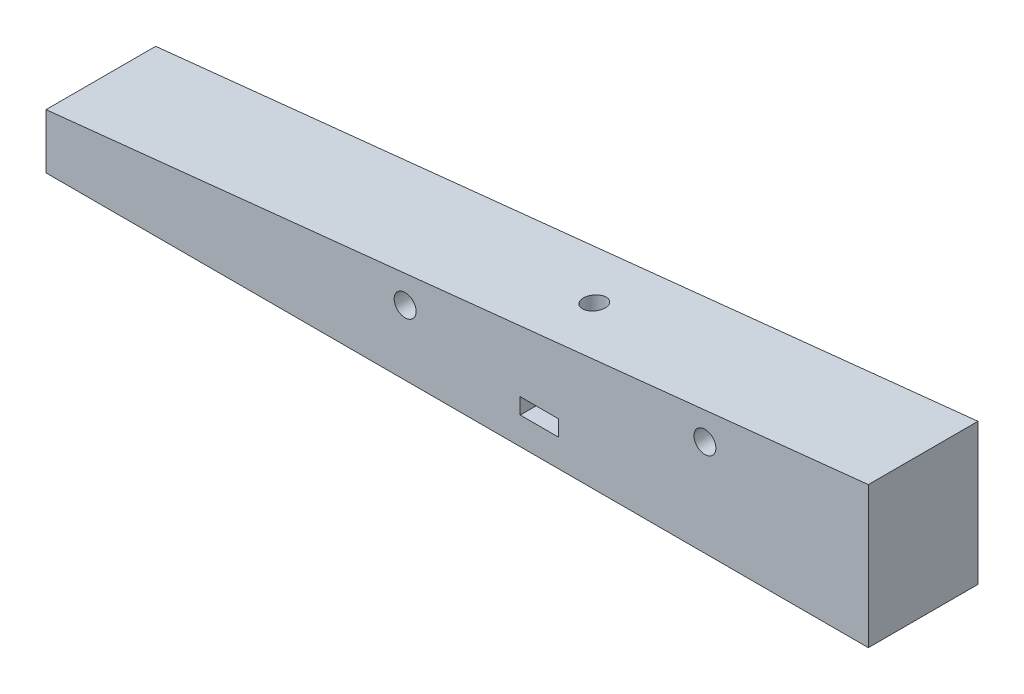
ISO-10303-21;
HEADER;
FILE_DESCRIPTION(('STEP AP214'),'2;1');
FILE_NAME('part.step','',(''),(''),'','','');
FILE_SCHEMA(('AUTOMOTIVE_DESIGN { 1 0 10303 214 1 1 1 1 }'));
ENDSEC;
DATA;
#1=APPLICATION_CONTEXT('core data for automotive mechanical design processes');
#2=APPLICATION_PROTOCOL_DEFINITION('international standard','automotive_design',2000,#1);
#3=PRODUCT_CONTEXT('',#1,'mechanical');
#4=PRODUCT('Part','Part','',(#3));
#5=PRODUCT_RELATED_PRODUCT_CATEGORY('part','',(#4));
#6=PRODUCT_DEFINITION_FORMATION('','',#4);
#7=PRODUCT_DEFINITION_CONTEXT('part definition',#1,'design');
#8=PRODUCT_DEFINITION('design','',#6,#7);
#9=PRODUCT_DEFINITION_SHAPE('','',#8);
#10=(LENGTH_UNIT() NAMED_UNIT(*) SI_UNIT(.MILLI.,.METRE.));
#11=(NAMED_UNIT(*) PLANE_ANGLE_UNIT() SI_UNIT($,.RADIAN.));
#12=(NAMED_UNIT(*) SI_UNIT($,.STERADIAN.) SOLID_ANGLE_UNIT());
#13=UNCERTAINTY_MEASURE_WITH_UNIT(LENGTH_MEASURE(1.E-05),#10,'distance_accuracy_value','');
#14=(GEOMETRIC_REPRESENTATION_CONTEXT(3) GLOBAL_UNCERTAINTY_ASSIGNED_CONTEXT((#13)) GLOBAL_UNIT_ASSIGNED_CONTEXT((#10,
#11,#12)) REPRESENTATION_CONTEXT('',''));
#15=CARTESIAN_POINT('',(0.,0.,0.));
#16=DIRECTION('',(0.,0.,1.));
#17=DIRECTION('',(1.,0.,0.));
#18=AXIS2_PLACEMENT_3D('',#15,#16,#17);
#19=CARTESIAN_POINT('',(-75.,10.,10.));
#20=DIRECTION('',(0.,0.,-1.));
#21=DIRECTION('',(-1.,0.,0.));
#22=AXIS2_PLACEMENT_3D('',#19,#20,#21);
#23=PLANE('',#22);
#24=CARTESIAN_POINT('',(-9.49268702190368,11.8575546370541,10.));
#25=DIRECTION('',(0.,0.,-1.));
#26=DIRECTION('',(-1.,0.,0.));
#27=AXIS2_PLACEMENT_3D('',#24,#25,#26);
#28=CIRCLE('',#27,2.);
#29=CARTESIAN_POINT('',(-11.4926870219037,11.8575546370541,10.));
#30=VERTEX_POINT('',#29);
#31=EDGE_CURVE('E216',#30,#30,#28,.T.);
#32=ORIENTED_EDGE('',*,*,#31,.T.);
#33=EDGE_LOOP('',(#32));
#34=FACE_BOUND('',#33,.T.);
#35=CARTESIAN_POINT('',(45.1864589676207,17.604564461263,10.));
#36=DIRECTION('',(0.,0.,-1.));
#37=DIRECTION('',(-1.,0.,0.));
#38=AXIS2_PLACEMENT_3D('',#35,#36,#37);
#39=CIRCLE('',#38,2.);
#40=CARTESIAN_POINT('',(43.1864589676207,17.604564461263,10.));
#41=VERTEX_POINT('',#40);
#42=EDGE_CURVE('E267',#41,#41,#39,.T.);
#43=ORIENTED_EDGE('',*,*,#42,.T.);
#44=EDGE_LOOP('',(#43));
#45=FACE_BOUND('',#44,.T.);
#46=DIRECTION('',(1.,0.,0.));
#47=VECTOR('',#46,1.);
#48=CARTESIAN_POINT('',(-75.,0.,10.));
#49=LINE('',#48,#47);
#50=CARTESIAN_POINT('',(-75.,0.,10.));
#51=VERTEX_POINT('',#50);
#52=CARTESIAN_POINT('',(75.,0.,10.));
#53=VERTEX_POINT('',#52);
#54=EDGE_CURVE('E88',#51,#53,#49,.T.);
#55=ORIENTED_EDGE('',*,*,#54,.T.);
#56=DIRECTION('',(0.,-1.,0.));
#57=VECTOR('',#56,1.);
#58=CARTESIAN_POINT('',(75.,10.,10.));
#59=LINE('',#58,#57);
#60=CARTESIAN_POINT('',(75.,25.7656352898504,10.));
#61=VERTEX_POINT('',#60);
#62=EDGE_CURVE('E91',#61,#53,#59,.T.);
#63=ORIENTED_EDGE('',*,*,#62,.F.);
#64=DIRECTION('',(-0.994521895368274,-0.104528463267647,0.));
#65=VECTOR('',#64,1.);
#66=CARTESIAN_POINT('',(75.,25.7656352898504,10.));
#67=LINE('',#66,#65);
#68=CARTESIAN_POINT('',(-75.,10.,10.));
#69=VERTEX_POINT('',#68);
#70=EDGE_CURVE('E116',#61,#69,#67,.T.);
#71=ORIENTED_EDGE('',*,*,#70,.T.);
#72=DIRECTION('',(0.,-1.,0.));
#73=VECTOR('',#72,1.);
#74=CARTESIAN_POINT('',(-75.,10.,10.));
#75=LINE('',#74,#73);
#76=EDGE_CURVE('E69',#69,#51,#75,.T.);
#77=ORIENTED_EDGE('',*,*,#76,.T.);
#78=EDGE_LOOP('',(#55,#63,#71,#77));
#79=FACE_BOUND('',#78,.T.);
#80=DIRECTION('',(1.,0.,0.));
#81=VECTOR('',#80,1.);
#82=CARTESIAN_POINT('',(11.5,7.9,10.));
#83=LINE('',#82,#81);
#84=CARTESIAN_POINT('',(11.5,7.9,10.));
#85=VERTEX_POINT('',#84);
#86=CARTESIAN_POINT('',(18.5,7.9,10.));
#87=VERTEX_POINT('',#86);
#88=EDGE_CURVE('E60',#85,#87,#83,.T.);
#89=ORIENTED_EDGE('',*,*,#88,.T.);
#90=DIRECTION('',(0.,-1.,0.));
#91=VECTOR('',#90,1.);
#92=CARTESIAN_POINT('',(18.5,7.9,10.));
#93=LINE('',#92,#91);
#94=CARTESIAN_POINT('',(18.5,5.,10.));
#95=VERTEX_POINT('',#94);
#96=EDGE_CURVE('E207',#87,#95,#93,.T.);
#97=ORIENTED_EDGE('',*,*,#96,.T.);
#98=DIRECTION('',(1.,0.,0.));
#99=VECTOR('',#98,1.);
#100=CARTESIAN_POINT('',(11.5,5.,10.));
#101=LINE('',#100,#99);
#102=CARTESIAN_POINT('',(11.5,5.,10.));
#103=VERTEX_POINT('',#102);
#104=EDGE_CURVE('E211',#103,#95,#101,.T.);
#105=ORIENTED_EDGE('',*,*,#104,.F.);
#106=DIRECTION('',(0.,-1.,0.));
#107=VECTOR('',#106,1.);
#108=CARTESIAN_POINT('',(11.5,7.9,10.));
#109=LINE('',#108,#107);
#110=EDGE_CURVE('E203',#85,#103,#109,.T.);
#111=ORIENTED_EDGE('',*,*,#110,.F.);
#112=EDGE_LOOP('',(#89,#97,#105,#111));
#113=FACE_BOUND('',#112,.T.);
#114=ADVANCED_FACE('F42',(#34,#45,#79,#113),#23,.F.);
#115=CARTESIAN_POINT('',(15.,25.7656352898504,0.));
#116=DIRECTION('',(0.,-1.,0.));
#117=DIRECTION('',(0.,0.,-1.));
#118=AXIS2_PLACEMENT_3D('',#115,#116,#117);
#119=CYLINDRICAL_SURFACE('',#118,2.);
#120=CARTESIAN_POINT('',(15.,19.4593811739103,0.));
#121=DIRECTION('',(0.104528463267647,-0.994521895368274,0.));
#122=DIRECTION('',(-0.994521895368274,-0.104528463267647,0.));
#123=AXIS2_PLACEMENT_3D('',#120,#121,#122);
#124=ELLIPSE('',#123,2.01101655912703,2.);
#125=CARTESIAN_POINT('',(13.,19.2491727033789,0.));
#126=VERTEX_POINT('',#125);
#127=EDGE_CURVE('E127',#126,#126,#124,.T.);
#128=ORIENTED_EDGE('',*,*,#127,.F.);
#129=EDGE_LOOP('',(#128));
#130=FACE_BOUND('',#129,.T.);
#131=CARTESIAN_POINT('',(15.,7.9,0.));
#132=DIRECTION('',(0.,-1.,0.));
#133=DIRECTION('',(1.,0.,0.));
#134=AXIS2_PLACEMENT_3D('',#131,#132,#133);
#135=CIRCLE('',#134,2.);
#136=CARTESIAN_POINT('',(17.,7.9,0.));
#137=VERTEX_POINT('',#136);
#138=EDGE_CURVE('E46',#137,#137,#135,.F.);
#139=ORIENTED_EDGE('',*,*,#138,.F.);
#140=EDGE_LOOP('',(#139));
#141=FACE_BOUND('',#140,.T.);
#142=ADVANCED_FACE('F233',(#130,#141),#119,.F.);
#143=CARTESIAN_POINT('',(75.,10.,10.));
#144=DIRECTION('',(-1.,0.,0.));
#145=DIRECTION('',(0.,0.,1.));
#146=AXIS2_PLACEMENT_3D('',#143,#144,#145);
#147=PLANE('',#146);
#148=DIRECTION('',(0.,0.,-1.));
#149=VECTOR('',#148,1.);
#150=CARTESIAN_POINT('',(75.,0.,10.));
#151=LINE('',#150,#149);
#152=CARTESIAN_POINT('',(75.,0.,-10.));
#153=VERTEX_POINT('',#152);
#154=EDGE_CURVE('E103',#53,#153,#151,.T.);
#155=ORIENTED_EDGE('',*,*,#154,.T.);
#156=DIRECTION('',(0.,-1.,0.));
#157=VECTOR('',#156,1.);
#158=CARTESIAN_POINT('',(75.,10.,-10.));
#159=LINE('',#158,#157);
#160=CARTESIAN_POINT('',(75.,25.7656352898504,-10.));
#161=VERTEX_POINT('',#160);
#162=EDGE_CURVE('E11',#161,#153,#159,.T.);
#163=ORIENTED_EDGE('',*,*,#162,.F.);
#164=DIRECTION('',(0.,0.,-1.));
#165=VECTOR('',#164,1.);
#166=CARTESIAN_POINT('',(75.,25.7656352898504,10.));
#167=LINE('',#166,#165);
#168=EDGE_CURVE('E105',#61,#161,#167,.T.);
#169=ORIENTED_EDGE('',*,*,#168,.F.);
#170=ORIENTED_EDGE('',*,*,#62,.T.);
#171=EDGE_LOOP('',(#155,#163,#169,#170));
#172=FACE_BOUND('',#171,.T.);
#173=ADVANCED_FACE('F44',(#172),#147,.F.);
#174=CARTESIAN_POINT('',(-75.,10.,-10.));
#175=DIRECTION('',(0.,0.,1.));
#176=DIRECTION('',(1.,0.,0.));
#177=AXIS2_PLACEMENT_3D('',#174,#175,#176);
#178=PLANE('',#177);
#179=CARTESIAN_POINT('',(-9.49268702190368,11.8575546370541,-10.));
#180=DIRECTION('',(0.,0.,1.));
#181=DIRECTION('',(1.,0.,0.));
#182=AXIS2_PLACEMENT_3D('',#179,#180,#181);
#183=CIRCLE('',#182,2.);
#184=CARTESIAN_POINT('',(-7.49268702190367,11.8575546370541,-10.));
#185=VERTEX_POINT('',#184);
#186=EDGE_CURVE('E259',#185,#185,#183,.T.);
#187=ORIENTED_EDGE('',*,*,#186,.T.);
#188=EDGE_LOOP('',(#187));
#189=FACE_BOUND('',#188,.T.);
#190=CARTESIAN_POINT('',(45.1864589676207,17.604564461263,-10.));
#191=DIRECTION('',(0.,0.,1.));
#192=DIRECTION('',(1.,0.,0.));
#193=AXIS2_PLACEMENT_3D('',#190,#191,#192);
#194=CIRCLE('',#193,2.);
#195=CARTESIAN_POINT('',(47.1864589676207,17.604564461263,-10.));
#196=VERTEX_POINT('',#195);
#197=EDGE_CURVE('E262',#196,#196,#194,.T.);
#198=ORIENTED_EDGE('',*,*,#197,.T.);
#199=EDGE_LOOP('',(#198));
#200=FACE_BOUND('',#199,.T.);
#201=DIRECTION('',(-1.,0.,0.));
#202=VECTOR('',#201,1.);
#203=CARTESIAN_POINT('',(-75.,0.,-10.));
#204=LINE('',#203,#202);
#205=CARTESIAN_POINT('',(-75.,0.,-10.));
#206=VERTEX_POINT('',#205);
#207=EDGE_CURVE('E110',#153,#206,#204,.T.);
#208=ORIENTED_EDGE('',*,*,#207,.T.);
#209=DIRECTION('',(0.,-1.,0.));
#210=VECTOR('',#209,1.);
#211=CARTESIAN_POINT('',(-75.,10.,-10.));
#212=LINE('',#211,#210);
#213=CARTESIAN_POINT('',(-75.,10.,-10.));
#214=VERTEX_POINT('',#213);
#215=EDGE_CURVE('E52',#214,#206,#212,.T.);
#216=ORIENTED_EDGE('',*,*,#215,.F.);
#217=DIRECTION('',(-0.994521895368274,-0.104528463267647,0.));
#218=VECTOR('',#217,1.);
#219=CARTESIAN_POINT('',(75.,25.7656352898504,-10.));
#220=LINE('',#219,#218);
#221=EDGE_CURVE('E130',#161,#214,#220,.T.);
#222=ORIENTED_EDGE('',*,*,#221,.F.);
#223=ORIENTED_EDGE('',*,*,#162,.T.);
#224=EDGE_LOOP('',(#208,#216,#222,#223));
#225=FACE_BOUND('',#224,.T.);
#226=ADVANCED_FACE('F165',(#189,#200,#225),#178,.F.);
#227=CARTESIAN_POINT('',(-75.,10.,10.));
#228=DIRECTION('',(1.,0.,0.));
#229=DIRECTION('',(0.,0.,-1.));
#230=AXIS2_PLACEMENT_3D('',#227,#228,#229);
#231=PLANE('',#230);
#232=DIRECTION('',(0.,0.,1.));
#233=VECTOR('',#232,1.);
#234=CARTESIAN_POINT('',(-75.,0.,10.));
#235=LINE('',#234,#233);
#236=EDGE_CURVE('E98',#206,#51,#235,.T.);
#237=ORIENTED_EDGE('',*,*,#236,.T.);
#238=ORIENTED_EDGE('',*,*,#76,.F.);
#239=DIRECTION('',(0.,0.,1.));
#240=VECTOR('',#239,1.);
#241=CARTESIAN_POINT('',(-75.,10.,10.));
#242=LINE('',#241,#240);
#243=EDGE_CURVE('E97',#214,#69,#242,.T.);
#244=ORIENTED_EDGE('',*,*,#243,.F.);
#245=ORIENTED_EDGE('',*,*,#215,.T.);
#246=EDGE_LOOP('',(#237,#238,#244,#245));
#247=FACE_BOUND('',#246,.T.);
#248=ADVANCED_FACE('F249',(#247),#231,.F.);
#249=CARTESIAN_POINT('',(0.,0.,0.));
#250=DIRECTION('',(0.,-1.,0.));
#251=DIRECTION('',(0.,0.,-1.));
#252=AXIS2_PLACEMENT_3D('',#249,#250,#251);
#253=PLANE('',#252);
#254=CARTESIAN_POINT('',(15.,0.,0.));
#255=DIRECTION('',(0.,-1.,0.));
#256=DIRECTION('',(0.,0.,-1.));
#257=AXIS2_PLACEMENT_3D('',#254,#255,#256);
#258=CIRCLE('',#257,2.);
#259=CARTESIAN_POINT('',(15.,0.,-2.));
#260=VERTEX_POINT('',#259);
#261=EDGE_CURVE('E131',#260,#260,#258,.T.);
#262=ORIENTED_EDGE('',*,*,#261,.F.);
#263=EDGE_LOOP('',(#262));
#264=FACE_BOUND('',#263,.T.);
#265=ORIENTED_EDGE('',*,*,#154,.F.);
#266=ORIENTED_EDGE('',*,*,#54,.F.);
#267=ORIENTED_EDGE('',*,*,#236,.F.);
#268=ORIENTED_EDGE('',*,*,#207,.F.);
#269=EDGE_LOOP('',(#265,#266,#267,#268));
#270=FACE_BOUND('',#269,.T.);
#271=ADVANCED_FACE('F109',(#264,#270),#253,.T.);
#272=CARTESIAN_POINT('',(75.,25.7656352898504,10.));
#273=DIRECTION('',(0.104528463267647,-0.994521895368274,0.));
#274=DIRECTION('',(0.994521895368274,0.104528463267647,0.));
#275=AXIS2_PLACEMENT_3D('',#272,#273,#274);
#276=PLANE('',#275);
#277=ORIENTED_EDGE('',*,*,#127,.T.);
#278=EDGE_LOOP('',(#277));
#279=FACE_BOUND('',#278,.T.);
#280=ORIENTED_EDGE('',*,*,#221,.T.);
#281=ORIENTED_EDGE('',*,*,#243,.T.);
#282=ORIENTED_EDGE('',*,*,#70,.F.);
#283=ORIENTED_EDGE('',*,*,#168,.T.);
#284=EDGE_LOOP('',(#280,#281,#282,#283));
#285=FACE_BOUND('',#284,.T.);
#286=ADVANCED_FACE('F162',(#279,#285),#276,.F.);
#287=CARTESIAN_POINT('',(15.,5.,0.));
#288=DIRECTION('',(0.,-1.,0.));
#289=DIRECTION('',(0.,0.,-1.));
#290=AXIS2_PLACEMENT_3D('',#287,#288,#289);
#291=CIRCLE('',#290,2.);
#292=CARTESIAN_POINT('',(15.,5.,-2.));
#293=VERTEX_POINT('',#292);
#294=EDGE_CURVE('E132',#293,#293,#291,.F.);
#295=CARTESIAN_POINT('',(15.,5.,-2.));
#296=CARTESIAN_POINT('',(15.,4.94791666666667,-2.));
#297=CARTESIAN_POINT('',(15.,4.89583333333333,-2.));
#298=CARTESIAN_POINT('',(15.,4.79166666666667,-2.));
#299=CARTESIAN_POINT('',(15.,4.73958333333333,-2.));
#300=CARTESIAN_POINT('',(15.,4.63541666666667,-2.));
#301=CARTESIAN_POINT('',(15.,4.58333333333333,-2.));
#302=CARTESIAN_POINT('',(15.,4.47916666666667,-2.));
#303=CARTESIAN_POINT('',(15.,4.42708333333333,-2.));
#304=CARTESIAN_POINT('',(15.,4.32291666666667,-2.));
#305=CARTESIAN_POINT('',(15.,4.27083333333333,-2.));
#306=CARTESIAN_POINT('',(15.,4.16666666666667,-2.));
#307=CARTESIAN_POINT('',(15.,4.11458333333333,-2.));
#308=CARTESIAN_POINT('',(15.,4.01041666666667,-2.));
#309=CARTESIAN_POINT('',(15.,3.95833333333333,-2.));
#310=CARTESIAN_POINT('',(15.,3.85416666666667,-2.));
#311=CARTESIAN_POINT('',(15.,3.80208333333333,-2.));
#312=CARTESIAN_POINT('',(15.,3.69791666666667,-2.));
#313=CARTESIAN_POINT('',(15.,3.64583333333334,-2.));
#314=CARTESIAN_POINT('',(15.,3.54166666666667,-2.));
#315=CARTESIAN_POINT('',(15.,3.48958333333334,-2.));
#316=CARTESIAN_POINT('',(15.,3.38541666666667,-2.));
#317=CARTESIAN_POINT('',(15.,3.33333333333334,-2.));
#318=CARTESIAN_POINT('',(15.,3.22916666666667,-2.));
#319=CARTESIAN_POINT('',(15.,3.17708333333334,-2.));
#320=CARTESIAN_POINT('',(15.,3.07291666666667,-2.));
#321=CARTESIAN_POINT('',(15.,3.02083333333334,-2.));
#322=CARTESIAN_POINT('',(15.,2.91666666666667,-2.));
#323=CARTESIAN_POINT('',(15.,2.86458333333334,-2.));
#324=CARTESIAN_POINT('',(15.,2.76041666666667,-2.));
#325=CARTESIAN_POINT('',(15.,2.70833333333334,-2.));
#326=CARTESIAN_POINT('',(15.,2.60416666666667,-2.));
#327=CARTESIAN_POINT('',(15.,2.55208333333334,-2.));
#328=CARTESIAN_POINT('',(15.,2.44791666666667,-2.));
#329=CARTESIAN_POINT('',(15.,2.39583333333334,-2.));
#330=CARTESIAN_POINT('',(15.,2.29166666666667,-2.));
#331=CARTESIAN_POINT('',(15.,2.23958333333334,-2.));
#332=CARTESIAN_POINT('',(15.,2.13541666666667,-2.));
#333=CARTESIAN_POINT('',(15.,2.08333333333334,-2.));
#334=CARTESIAN_POINT('',(15.,1.97916666666667,-2.));
#335=CARTESIAN_POINT('',(15.,1.92708333333334,-2.));
#336=CARTESIAN_POINT('',(15.,1.82291666666667,-2.));
#337=CARTESIAN_POINT('',(15.,1.77083333333334,-2.));
#338=CARTESIAN_POINT('',(15.,1.66666666666667,-2.));
#339=CARTESIAN_POINT('',(15.,1.61458333333333,-2.));
#340=CARTESIAN_POINT('',(15.,1.51041666666667,-2.));
#341=CARTESIAN_POINT('',(15.,1.45833333333333,-2.));
#342=CARTESIAN_POINT('',(15.,1.35416666666667,-2.));
#343=CARTESIAN_POINT('',(15.,1.30208333333334,-2.));
#344=CARTESIAN_POINT('',(15.,1.19791666666667,-2.));
#345=CARTESIAN_POINT('',(15.,1.14583333333334,-2.));
#346=CARTESIAN_POINT('',(15.,1.04166666666667,-2.));
#347=CARTESIAN_POINT('',(15.,0.989583333333336,-2.));
#348=CARTESIAN_POINT('',(15.,0.885416666666671,-2.));
#349=CARTESIAN_POINT('',(15.,0.833333333333337,-2.));
#350=CARTESIAN_POINT('',(15.,0.729166666666671,-2.));
#351=CARTESIAN_POINT('',(15.,0.677083333333337,-2.));
#352=CARTESIAN_POINT('',(15.,0.572916666666671,-2.));
#353=CARTESIAN_POINT('',(15.,0.520833333333337,-2.));
#354=CARTESIAN_POINT('',(15.,0.416666666666671,-2.));
#355=CARTESIAN_POINT('',(15.,0.364583333333337,-2.));
#356=CARTESIAN_POINT('',(15.,0.26041666666667,-2.));
#357=CARTESIAN_POINT('',(15.,0.208333333333337,-2.));
#358=CARTESIAN_POINT('',(15.,0.10416666666667,-2.));
#359=CARTESIAN_POINT('',(15.,0.0520833333333369,-2.));
#360=CARTESIAN_POINT('',(15.,0.,-2.));
#361=B_SPLINE_CURVE_WITH_KNOTS('',3,(#295,#296,#297,#298,#299,#300,#301,#302,#303,#304,#305,
#306,#307,#308,#309,#310,#311,#312,#313,#314,#315,#316,#317,#318,#319,#320,#321,#322,#323,#324,
#325,#326,#327,#328,#329,#330,#331,#332,#333,#334,#335,#336,#337,#338,#339,#340,#341,#342,#343,
#344,#345,#346,#347,#348,#349,#350,#351,#352,#353,#354,#355,#356,#357,#358,#359,#360),
.UNSPECIFIED.,.F.,.F.,(4,2,2,2,2,2,2,2,2,2,2,2,2,2,2,2,2,2,2,2,2,2,2,2,2,2,2,2,2,2,2,2,4),(0.,
0.15625,0.3125,0.46875,0.625000000000001,0.781250000000001,0.937500000000001,1.09375,1.25,
1.40625,1.5625,1.71875,1.875,2.03125,2.1875,2.34375,2.5,2.65625,2.8125,2.96875,3.125,3.28125,
3.4375,3.59375,3.75,3.90625,4.0625,4.21875,4.375,4.53125,4.6875,4.84375,5.),.UNSPECIFIED.);
#362=EDGE_CURVE('BSEAM243',#293,#260,#361,.T.);
#363=ORIENTED_EDGE('',*,*,#294,.T.);
#364=ORIENTED_EDGE('',*,*,#261,.T.);
#365=ORIENTED_EDGE('',*,*,#362,.T.);
#366=ORIENTED_EDGE('',*,*,#362,.F.);
#367=EDGE_LOOP('',(#363,#365,#364,#366));
#368=FACE_BOUND('',#367,.T.);
#369=ADVANCED_FACE('F243',(#368),#119,.F.);
#370=CARTESIAN_POINT('',(11.5,7.9,-3.8));
#371=DIRECTION('',(0.,-1.,0.));
#372=DIRECTION('',(1.,0.,0.));
#373=AXIS2_PLACEMENT_3D('',#370,#371,#372);
#374=PLANE('',#373);
#375=ORIENTED_EDGE('',*,*,#88,.F.);
#376=DIRECTION('',(0.,0.,1.));
#377=VECTOR('',#376,1.);
#378=CARTESIAN_POINT('',(11.5,7.9,-3.8));
#379=LINE('',#378,#377);
#380=CARTESIAN_POINT('',(11.5,7.9,-3.8));
#381=VERTEX_POINT('',#380);
#382=EDGE_CURVE('E201',#381,#85,#379,.T.);
#383=ORIENTED_EDGE('',*,*,#382,.F.);
#384=DIRECTION('',(1.,0.,0.));
#385=VECTOR('',#384,1.);
#386=CARTESIAN_POINT('',(11.5,7.9,-3.8));
#387=LINE('',#386,#385);
#388=CARTESIAN_POINT('',(18.5,7.9,-3.8));
#389=VERTEX_POINT('',#388);
#390=EDGE_CURVE('E191',#381,#389,#387,.T.);
#391=ORIENTED_EDGE('',*,*,#390,.T.);
#392=DIRECTION('',(0.,0.,1.));
#393=VECTOR('',#392,1.);
#394=CARTESIAN_POINT('',(18.5,7.9,-3.8));
#395=LINE('',#394,#393);
#396=EDGE_CURVE('E135',#389,#87,#395,.T.);
#397=ORIENTED_EDGE('',*,*,#396,.T.);
#398=EDGE_LOOP('',(#375,#383,#391,#397));
#399=FACE_BOUND('',#398,.T.);
#400=ORIENTED_EDGE('',*,*,#138,.T.);
#401=EDGE_LOOP('',(#400));
#402=FACE_BOUND('',#401,.T.);
#403=ADVANCED_FACE('F199',(#399,#402),#374,.T.);
#404=CARTESIAN_POINT('',(11.5,5.,-3.8));
#405=DIRECTION('',(0.,-1.,0.));
#406=DIRECTION('',(0.,0.,-1.));
#407=AXIS2_PLACEMENT_3D('',#404,#405,#406);
#408=PLANE('',#407);
#409=ORIENTED_EDGE('',*,*,#104,.T.);
#410=DIRECTION('',(0.,0.,1.));
#411=VECTOR('',#410,1.);
#412=CARTESIAN_POINT('',(18.5,5.,-3.8));
#413=LINE('',#412,#411);
#414=CARTESIAN_POINT('',(18.5,5.,-3.8));
#415=VERTEX_POINT('',#414);
#416=EDGE_CURVE('E141',#415,#95,#413,.T.);
#417=ORIENTED_EDGE('',*,*,#416,.F.);
#418=DIRECTION('',(1.,0.,0.));
#419=VECTOR('',#418,1.);
#420=CARTESIAN_POINT('',(11.5,5.,-3.8));
#421=LINE('',#420,#419);
#422=CARTESIAN_POINT('',(11.5,5.,-3.8));
#423=VERTEX_POINT('',#422);
#424=EDGE_CURVE('E194',#423,#415,#421,.T.);
#425=ORIENTED_EDGE('',*,*,#424,.F.);
#426=DIRECTION('',(0.,0.,1.));
#427=VECTOR('',#426,1.);
#428=CARTESIAN_POINT('',(11.5,5.,-3.8));
#429=LINE('',#428,#427);
#430=EDGE_CURVE('E148',#423,#103,#429,.T.);
#431=ORIENTED_EDGE('',*,*,#430,.T.);
#432=EDGE_LOOP('',(#409,#417,#425,#431));
#433=FACE_BOUND('',#432,.T.);
#434=ORIENTED_EDGE('',*,*,#294,.F.);
#435=EDGE_LOOP('',(#434));
#436=FACE_BOUND('',#435,.T.);
#437=ADVANCED_FACE('F227',(#433,#436),#408,.F.);
#438=CARTESIAN_POINT('',(18.5,7.9,-3.8));
#439=DIRECTION('',(-1.,0.,0.));
#440=DIRECTION('',(0.,0.,1.));
#441=AXIS2_PLACEMENT_3D('',#438,#439,#440);
#442=PLANE('',#441);
#443=ORIENTED_EDGE('',*,*,#96,.F.);
#444=ORIENTED_EDGE('',*,*,#396,.F.);
#445=DIRECTION('',(0.,-1.,0.));
#446=VECTOR('',#445,1.);
#447=CARTESIAN_POINT('',(18.5,7.9,-3.8));
#448=LINE('',#447,#446);
#449=EDGE_CURVE('E188',#389,#415,#448,.T.);
#450=ORIENTED_EDGE('',*,*,#449,.T.);
#451=ORIENTED_EDGE('',*,*,#416,.T.);
#452=EDGE_LOOP('',(#443,#444,#450,#451));
#453=FACE_BOUND('',#452,.T.);
#454=ADVANCED_FACE('F205',(#453),#442,.T.);
#455=CARTESIAN_POINT('',(11.5,7.9,-3.8));
#456=DIRECTION('',(-1.,0.,0.));
#457=DIRECTION('',(0.,-1.,0.));
#458=AXIS2_PLACEMENT_3D('',#455,#456,#457);
#459=PLANE('',#458);
#460=ORIENTED_EDGE('',*,*,#110,.T.);
#461=ORIENTED_EDGE('',*,*,#430,.F.);
#462=DIRECTION('',(0.,-1.,0.));
#463=VECTOR('',#462,1.);
#464=CARTESIAN_POINT('',(11.5,7.9,-3.8));
#465=LINE('',#464,#463);
#466=EDGE_CURVE('E224',#381,#423,#465,.T.);
#467=ORIENTED_EDGE('',*,*,#466,.F.);
#468=ORIENTED_EDGE('',*,*,#382,.T.);
#469=EDGE_LOOP('',(#460,#461,#467,#468));
#470=FACE_BOUND('',#469,.T.);
#471=ADVANCED_FACE('F231',(#470),#459,.F.);
#472=CARTESIAN_POINT('',(0.,0.,-3.8));
#473=DIRECTION('',(0.,0.,-1.));
#474=DIRECTION('',(-1.,0.,0.));
#475=AXIS2_PLACEMENT_3D('',#472,#473,#474);
#476=PLANE('',#475);
#477=ORIENTED_EDGE('',*,*,#390,.F.);
#478=ORIENTED_EDGE('',*,*,#466,.T.);
#479=ORIENTED_EDGE('',*,*,#424,.T.);
#480=ORIENTED_EDGE('',*,*,#449,.F.);
#481=EDGE_LOOP('',(#477,#478,#479,#480));
#482=FACE_BOUND('',#481,.T.);
#483=ADVANCED_FACE('F189',(#482),#476,.F.);
#484=CARTESIAN_POINT('',(45.1864589676207,17.604564461263,-10.));
#485=DIRECTION('',(0.,0.,1.));
#486=DIRECTION('',(1.,0.,0.));
#487=AXIS2_PLACEMENT_3D('',#484,#485,#486);
#488=CYLINDRICAL_SURFACE('',#487,2.);
#489=ORIENTED_EDGE('',*,*,#197,.F.);
#490=EDGE_LOOP('',(#489));
#491=FACE_BOUND('',#490,.T.);
#492=ORIENTED_EDGE('',*,*,#42,.F.);
#493=EDGE_LOOP('',(#492));
#494=FACE_BOUND('',#493,.T.);
#495=ADVANCED_FACE('F281',(#491,#494),#488,.F.);
#496=CARTESIAN_POINT('',(-9.49268702190368,11.8575546370541,-10.));
#497=DIRECTION('',(0.,0.,1.));
#498=DIRECTION('',(1.,0.,0.));
#499=AXIS2_PLACEMENT_3D('',#496,#497,#498);
#500=CYLINDRICAL_SURFACE('',#499,2.);
#501=ORIENTED_EDGE('',*,*,#186,.F.);
#502=EDGE_LOOP('',(#501));
#503=FACE_BOUND('',#502,.T.);
#504=ORIENTED_EDGE('',*,*,#31,.F.);
#505=EDGE_LOOP('',(#504));
#506=FACE_BOUND('',#505,.T.);
#507=ADVANCED_FACE('F279',(#503,#506),#500,.F.);
#508=CLOSED_SHELL('',(#114,#142,#173,#226,#248,#271,#286,#369,#403,#437,#454,#471,#483,#495,#507));
#509=MANIFOLD_SOLID_BREP('B2',#508);
#510=ADVANCED_BREP_SHAPE_REPRESENTATION('',(#18,#509),#14);
#511=SHAPE_DEFINITION_REPRESENTATION(#9,#510);
ENDSEC;
END-ISO-10303-21;
